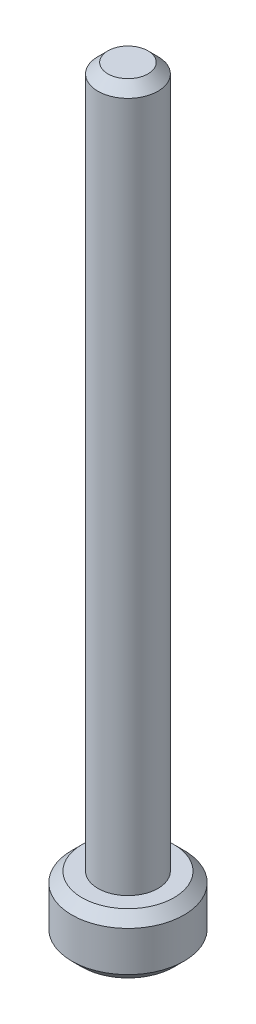
ISO-10303-21;
HEADER;
FILE_DESCRIPTION(('STEP AP214'),'2;1');
FILE_NAME('part.step','',(''),(''),'','','');
FILE_SCHEMA(('AUTOMOTIVE_DESIGN { 1 0 10303 214 1 1 1 1 }'));
ENDSEC;
DATA;
#1=APPLICATION_CONTEXT('core data for automotive mechanical design processes');
#2=APPLICATION_PROTOCOL_DEFINITION('international standard','automotive_design',2000,#1);
#3=PRODUCT_CONTEXT('',#1,'mechanical');
#4=PRODUCT('Part','Part','',(#3));
#5=PRODUCT_RELATED_PRODUCT_CATEGORY('part','',(#4));
#6=PRODUCT_DEFINITION_FORMATION('','',#4);
#7=PRODUCT_DEFINITION_CONTEXT('part definition',#1,'design');
#8=PRODUCT_DEFINITION('design','',#6,#7);
#9=PRODUCT_DEFINITION_SHAPE('','',#8);
#10=(LENGTH_UNIT() NAMED_UNIT(*) SI_UNIT(.MILLI.,.METRE.));
#11=(NAMED_UNIT(*) PLANE_ANGLE_UNIT() SI_UNIT($,.RADIAN.));
#12=(NAMED_UNIT(*) SI_UNIT($,.STERADIAN.) SOLID_ANGLE_UNIT());
#13=UNCERTAINTY_MEASURE_WITH_UNIT(LENGTH_MEASURE(1.E-05),#10,'distance_accuracy_value','');
#14=(GEOMETRIC_REPRESENTATION_CONTEXT(3) GLOBAL_UNCERTAINTY_ASSIGNED_CONTEXT((#13)) GLOBAL_UNIT_ASSIGNED_CONTEXT((#10,
#11,#12)) REPRESENTATION_CONTEXT('',''));
#15=CARTESIAN_POINT('',(0.,0.,0.));
#16=DIRECTION('',(0.,0.,1.));
#17=DIRECTION('',(1.,0.,0.));
#18=AXIS2_PLACEMENT_3D('',#15,#16,#17);
#19=CARTESIAN_POINT('',(0.,1.5,0.));
#20=DIRECTION('',(0.,-1.,0.));
#21=DIRECTION('',(0.,0.,-1.));
#22=AXIS2_PLACEMENT_3D('',#19,#20,#21);
#23=CYLINDRICAL_SURFACE('',#22,2.8);
#24=CARTESIAN_POINT('',(0.,1.,0.));
#25=DIRECTION('',(0.,1.,0.));
#26=DIRECTION('',(0.,0.,1.));
#27=AXIS2_PLACEMENT_3D('',#24,#25,#26);
#28=CIRCLE('',#27,2.8);
#29=CARTESIAN_POINT('',(0.,1.,2.8));
#30=VERTEX_POINT('',#29);
#31=EDGE_CURVE('E49',#30,#30,#28,.F.);
#32=ORIENTED_EDGE('',*,*,#31,.T.);
#33=EDGE_LOOP('',(#32));
#34=FACE_BOUND('',#33,.T.);
#35=CARTESIAN_POINT('',(0.,-0.999999999999985,0.));
#36=DIRECTION('',(0.,1.,0.));
#37=DIRECTION('',(0.,0.,1.));
#38=AXIS2_PLACEMENT_3D('',#35,#36,#37);
#39=CIRCLE('',#38,2.8);
#40=CARTESIAN_POINT('',(0.,-0.999999999999985,2.8));
#41=VERTEX_POINT('',#40);
#42=EDGE_CURVE('E53',#41,#41,#39,.T.);
#43=ORIENTED_EDGE('',*,*,#42,.T.);
#44=EDGE_LOOP('',(#43));
#45=FACE_BOUND('',#44,.T.);
#46=ADVANCED_FACE('F41',(#34,#45),#23,.T.);
#47=CARTESIAN_POINT('',(0.,1.5,0.));
#48=DIRECTION('',(0.,1.,0.));
#49=DIRECTION('',(0.,0.,1.));
#50=AXIS2_PLACEMENT_3D('',#47,#48,#49);
#51=PLANE('',#50);
#52=CARTESIAN_POINT('',(0.,1.5,0.));
#53=DIRECTION('',(0.,1.,0.));
#54=DIRECTION('',(0.,0.,1.));
#55=AXIS2_PLACEMENT_3D('',#52,#53,#54);
#56=CIRCLE('',#55,2.3);
#57=CARTESIAN_POINT('',(0.,1.5,2.3));
#58=VERTEX_POINT('',#57);
#59=EDGE_CURVE('E57',#58,#58,#56,.T.);
#60=ORIENTED_EDGE('',*,*,#59,.T.);
#61=EDGE_LOOP('',(#60));
#62=FACE_BOUND('',#61,.T.);
#63=CARTESIAN_POINT('',(0.,1.5,0.));
#64=DIRECTION('',(0.,1.,0.));
#65=DIRECTION('',(0.,0.,1.));
#66=AXIS2_PLACEMENT_3D('',#63,#64,#65);
#67=CIRCLE('',#66,1.5);
#68=CARTESIAN_POINT('',(0.,1.5,1.5));
#69=VERTEX_POINT('',#68);
#70=EDGE_CURVE('E68',#69,#69,#67,.T.);
#71=ORIENTED_EDGE('',*,*,#70,.F.);
#72=EDGE_LOOP('',(#71));
#73=FACE_BOUND('',#72,.T.);
#74=ADVANCED_FACE('F74',(#62,#73),#51,.T.);
#75=CARTESIAN_POINT('',(0.,-1.5,0.));
#76=DIRECTION('',(0.,1.,0.));
#77=DIRECTION('',(0.,0.,1.));
#78=AXIS2_PLACEMENT_3D('',#75,#76,#77);
#79=PLANE('',#78);
#80=CARTESIAN_POINT('',(0.,-1.5,0.));
#81=DIRECTION('',(0.,1.,0.));
#82=DIRECTION('',(0.,0.,1.));
#83=AXIS2_PLACEMENT_3D('',#80,#81,#82);
#84=CIRCLE('',#83,2.29999999999998);
#85=CARTESIAN_POINT('',(0.,-1.5,2.29999999999998));
#86=VERTEX_POINT('',#85);
#87=EDGE_CURVE('E10',#86,#86,#84,.F.);
#88=ORIENTED_EDGE('',*,*,#87,.T.);
#89=EDGE_LOOP('',(#88));
#90=FACE_BOUND('',#89,.T.);
#91=ADVANCED_FACE('F76',(#90),#79,.F.);
#92=CARTESIAN_POINT('',(0.,36.5,0.));
#93=DIRECTION('',(0.,-1.,0.));
#94=DIRECTION('',(0.,0.,-1.));
#95=AXIS2_PLACEMENT_3D('',#92,#93,#94);
#96=CYLINDRICAL_SURFACE('',#95,1.5);
#97=CARTESIAN_POINT('',(0.,36.,0.));
#98=DIRECTION('',(0.,1.,0.));
#99=DIRECTION('',(0.,0.,1.));
#100=AXIS2_PLACEMENT_3D('',#97,#98,#99);
#101=CIRCLE('',#100,1.5);
#102=CARTESIAN_POINT('',(0.,36.,1.5));
#103=VERTEX_POINT('',#102);
#104=EDGE_CURVE('E62',#103,#103,#101,.F.);
#105=ORIENTED_EDGE('',*,*,#104,.T.);
#106=EDGE_LOOP('',(#105));
#107=FACE_BOUND('',#106,.T.);
#108=ORIENTED_EDGE('',*,*,#70,.T.);
#109=EDGE_LOOP('',(#108));
#110=FACE_BOUND('',#109,.T.);
#111=ADVANCED_FACE('F72',(#107,#110),#96,.T.);
#112=CARTESIAN_POINT('',(0.,36.5,0.));
#113=DIRECTION('',(0.,1.,0.));
#114=DIRECTION('',(0.,0.,1.));
#115=AXIS2_PLACEMENT_3D('',#112,#113,#114);
#116=PLANE('',#115);
#117=CARTESIAN_POINT('',(0.,36.5,0.));
#118=DIRECTION('',(0.,1.,0.));
#119=DIRECTION('',(0.,0.,1.));
#120=AXIS2_PLACEMENT_3D('',#117,#118,#119);
#121=CIRCLE('',#120,1.00000000000001);
#122=CARTESIAN_POINT('',(0.,36.5,1.00000000000001));
#123=VERTEX_POINT('',#122);
#124=EDGE_CURVE('E65',#123,#123,#121,.T.);
#125=ORIENTED_EDGE('',*,*,#124,.T.);
#126=EDGE_LOOP('',(#125));
#127=FACE_BOUND('',#126,.T.);
#128=ADVANCED_FACE('F95',(#127),#116,.T.);
#129=CARTESIAN_POINT('',(0.,36.5,0.));
#130=DIRECTION('',(0.,-1.,0.));
#131=DIRECTION('',(0.,0.,-1.));
#132=AXIS2_PLACEMENT_3D('',#129,#130,#131);
#133=CONICAL_SURFACE('',#132,1.00000000000001,0.785398163397444);
#134=ORIENTED_EDGE('',*,*,#104,.F.);
#135=EDGE_LOOP('',(#134));
#136=FACE_BOUND('',#135,.T.);
#137=ORIENTED_EDGE('',*,*,#124,.F.);
#138=EDGE_LOOP('',(#137));
#139=FACE_BOUND('',#138,.T.);
#140=ADVANCED_FACE('F89',(#136,#139),#133,.T.);
#141=CARTESIAN_POINT('',(0.,1.5,0.));
#142=DIRECTION('',(0.,-1.,0.));
#143=DIRECTION('',(0.,0.,-1.));
#144=AXIS2_PLACEMENT_3D('',#141,#142,#143);
#145=CONICAL_SURFACE('',#144,2.3,0.785398163397449);
#146=ORIENTED_EDGE('',*,*,#31,.F.);
#147=EDGE_LOOP('',(#146));
#148=FACE_BOUND('',#147,.T.);
#149=ORIENTED_EDGE('',*,*,#59,.F.);
#150=EDGE_LOOP('',(#149));
#151=FACE_BOUND('',#150,.T.);
#152=ADVANCED_FACE('F94',(#148,#151),#145,.T.);
#153=CARTESIAN_POINT('',(0.,-0.999999999999985,0.));
#154=DIRECTION('',(0.,1.,0.));
#155=DIRECTION('',(0.,0.,1.));
#156=AXIS2_PLACEMENT_3D('',#153,#154,#155);
#157=CONICAL_SURFACE('',#156,2.8,0.785398163397451);
#158=ORIENTED_EDGE('',*,*,#87,.F.);
#159=EDGE_LOOP('',(#158));
#160=FACE_BOUND('',#159,.T.);
#161=ORIENTED_EDGE('',*,*,#42,.F.);
#162=EDGE_LOOP('',(#161));
#163=FACE_BOUND('',#162,.T.);
#164=ADVANCED_FACE('F44',(#160,#163),#157,.T.);
#165=CLOSED_SHELL('',(#46,#74,#91,#111,#128,#140,#152,#164));
#166=MANIFOLD_SOLID_BREP('B2',#165);
#167=ADVANCED_BREP_SHAPE_REPRESENTATION('',(#18,#166),#14);
#168=SHAPE_DEFINITION_REPRESENTATION(#9,#167);
ENDSEC;
END-ISO-10303-21;
